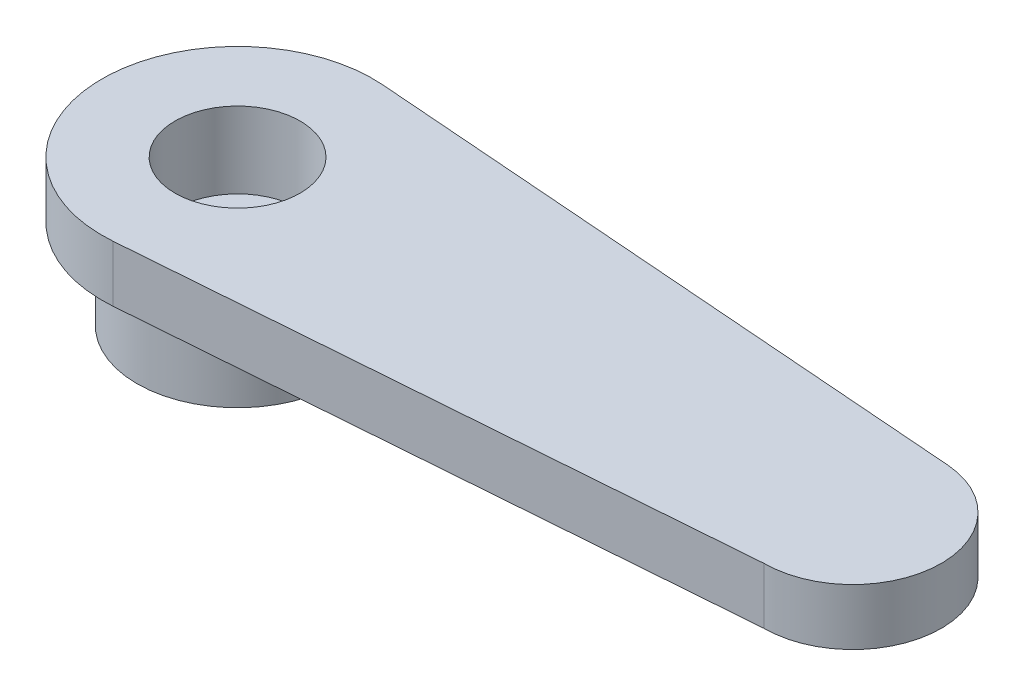
ISO-10303-21;
HEADER;
FILE_DESCRIPTION(('STEP AP214'),'2;1');
FILE_NAME('part.step','',(''),(''),'','','');
FILE_SCHEMA(('AUTOMOTIVE_DESIGN { 1 0 10303 214 1 1 1 1 }'));
ENDSEC;
DATA;
#1=APPLICATION_CONTEXT('core data for automotive mechanical design processes');
#2=APPLICATION_PROTOCOL_DEFINITION('international standard','automotive_design',2000,#1);
#3=PRODUCT_CONTEXT('',#1,'mechanical');
#4=PRODUCT('Part','Part','',(#3));
#5=PRODUCT_RELATED_PRODUCT_CATEGORY('part','',(#4));
#6=PRODUCT_DEFINITION_FORMATION('','',#4);
#7=PRODUCT_DEFINITION_CONTEXT('part definition',#1,'design');
#8=PRODUCT_DEFINITION('design','',#6,#7);
#9=PRODUCT_DEFINITION_SHAPE('','',#8);
#10=(LENGTH_UNIT() NAMED_UNIT(*) SI_UNIT(.MILLI.,.METRE.));
#11=(NAMED_UNIT(*) PLANE_ANGLE_UNIT() SI_UNIT($,.RADIAN.));
#12=(NAMED_UNIT(*) SI_UNIT($,.STERADIAN.) SOLID_ANGLE_UNIT());
#13=UNCERTAINTY_MEASURE_WITH_UNIT(LENGTH_MEASURE(1.E-05),#10,'distance_accuracy_value','');
#14=(GEOMETRIC_REPRESENTATION_CONTEXT(3) GLOBAL_UNCERTAINTY_ASSIGNED_CONTEXT((#13)) GLOBAL_UNIT_ASSIGNED_CONTEXT((#10,
#11,#12)) REPRESENTATION_CONTEXT('',''));
#15=CARTESIAN_POINT('',(0.,0.,0.));
#16=DIRECTION('',(0.,0.,1.));
#17=DIRECTION('',(1.,0.,0.));
#18=AXIS2_PLACEMENT_3D('',#15,#16,#17);
#19=CARTESIAN_POINT('',(0.,2.7,0.));
#20=DIRECTION('',(0.,-1.,0.));
#21=DIRECTION('',(0.,0.,-1.));
#22=AXIS2_PLACEMENT_3D('',#19,#20,#21);
#23=CYLINDRICAL_SURFACE('',#22,6.5);
#24=CARTESIAN_POINT('',(0.,0.,0.));
#25=DIRECTION('',(0.,1.,0.));
#26=DIRECTION('',(0.,0.,1.));
#27=AXIS2_PLACEMENT_3D('',#24,#25,#26);
#28=CIRCLE('',#27,6.5);
#29=CARTESIAN_POINT('',(0.495762711864406,0.,-6.48106621888134));
#30=VERTEX_POINT('',#29);
#31=CARTESIAN_POINT('',(0.498520941628804,0.,6.48085464045889));
#32=VERTEX_POINT('',#31);
#33=EDGE_CURVE('E96',#30,#32,#28,.T.);
#34=ORIENTED_EDGE('',*,*,#33,.T.);
#35=DIRECTION('',(0.,-1.,0.));
#36=VECTOR('',#35,1.);
#37=CARTESIAN_POINT('',(0.498520941628804,2.7,6.48085464045889));
#38=LINE('',#37,#36);
#39=CARTESIAN_POINT('',(0.498520941628804,2.7,6.48085464045889));
#40=VERTEX_POINT('',#39);
#41=EDGE_CURVE('E11',#40,#32,#38,.T.);
#42=ORIENTED_EDGE('',*,*,#41,.F.);
#43=CARTESIAN_POINT('',(0.,2.7,0.));
#44=DIRECTION('',(0.,1.,0.));
#45=DIRECTION('',(0.,0.,1.));
#46=AXIS2_PLACEMENT_3D('',#43,#44,#45);
#47=CIRCLE('',#46,6.5);
#48=CARTESIAN_POINT('',(0.495762711864406,2.7,-6.48106621888134));
#49=VERTEX_POINT('',#48);
#50=EDGE_CURVE('E82',#49,#40,#47,.T.);
#51=ORIENTED_EDGE('',*,*,#50,.F.);
#52=DIRECTION('',(0.,-1.,0.));
#53=VECTOR('',#52,1.);
#54=CARTESIAN_POINT('',(0.495762711864406,2.7,-6.48106621888134));
#55=LINE('',#54,#53);
#56=EDGE_CURVE('E49',#49,#30,#55,.T.);
#57=ORIENTED_EDGE('',*,*,#56,.T.);
#58=EDGE_LOOP('',(#34,#42,#51,#57));
#59=FACE_BOUND('',#58,.T.);
#60=ADVANCED_FACE('F33',(#59),#23,.T.);
#61=CARTESIAN_POINT('',(0.498520941628804,2.7,6.48085464045889));
#62=DIRECTION('',(-0.0766955294813543,0.,-0.997054560070598));
#63=DIRECTION('',(-0.997054560070599,0.,0.0766955294813543));
#64=AXIS2_PLACEMENT_3D('',#61,#62,#63);
#65=PLANE('',#64);
#66=DIRECTION('',(0.997054560070598,0.,-0.0766955294813543));
#67=VECTOR('',#66,1.);
#68=CARTESIAN_POINT('',(0.498520941628804,0.,6.48085464045889));
#69=LINE('',#68,#67);
#70=CARTESIAN_POINT('',(29.5,0.,4.25));
#71=VERTEX_POINT('',#70);
#72=EDGE_CURVE('E87',#32,#71,#69,.T.);
#73=ORIENTED_EDGE('',*,*,#72,.T.);
#74=DIRECTION('',(0.,-1.,0.));
#75=VECTOR('',#74,1.);
#76=CARTESIAN_POINT('',(29.5,2.7,4.25));
#77=LINE('',#76,#75);
#78=CARTESIAN_POINT('',(29.5,2.7,4.25));
#79=VERTEX_POINT('',#78);
#80=EDGE_CURVE('E41',#79,#71,#77,.T.);
#81=ORIENTED_EDGE('',*,*,#80,.F.);
#82=DIRECTION('',(0.997054560070598,0.,-0.0766955294813543));
#83=VECTOR('',#82,1.);
#84=CARTESIAN_POINT('',(0.498520941628804,2.7,6.48085464045889));
#85=LINE('',#84,#83);
#86=EDGE_CURVE('E75',#40,#79,#85,.T.);
#87=ORIENTED_EDGE('',*,*,#86,.F.);
#88=ORIENTED_EDGE('',*,*,#41,.T.);
#89=EDGE_LOOP('',(#73,#81,#87,#88));
#90=FACE_BOUND('',#89,.T.);
#91=ADVANCED_FACE('F86',(#90),#65,.F.);
#92=CARTESIAN_POINT('',(29.5,2.7,0.));
#93=DIRECTION('',(0.,-1.,0.));
#94=DIRECTION('',(0.,0.,-1.));
#95=AXIS2_PLACEMENT_3D('',#92,#93,#94);
#96=CYLINDRICAL_SURFACE('',#95,4.25);
#97=CARTESIAN_POINT('',(29.5,0.,0.));
#98=DIRECTION('',(0.,1.,0.));
#99=DIRECTION('',(0.,0.,1.));
#100=AXIS2_PLACEMENT_3D('',#97,#98,#99);
#101=CIRCLE('',#100,4.25);
#102=CARTESIAN_POINT('',(29.8241525423729,0.,-4.2376202200378));
#103=VERTEX_POINT('',#102);
#104=EDGE_CURVE('E100',#71,#103,#101,.T.);
#105=ORIENTED_EDGE('',*,*,#104,.T.);
#106=DIRECTION('',(0.,-1.,0.));
#107=VECTOR('',#106,1.);
#108=CARTESIAN_POINT('',(29.8241525423729,2.7,-4.2376202200378));
#109=LINE('',#108,#107);
#110=CARTESIAN_POINT('',(29.8241525423729,2.7,-4.2376202200378));
#111=VERTEX_POINT('',#110);
#112=EDGE_CURVE('E64',#111,#103,#109,.T.);
#113=ORIENTED_EDGE('',*,*,#112,.F.);
#114=CARTESIAN_POINT('',(29.5,2.7,0.));
#115=DIRECTION('',(0.,1.,0.));
#116=DIRECTION('',(0.,0.,1.));
#117=AXIS2_PLACEMENT_3D('',#114,#115,#116);
#118=CIRCLE('',#117,4.25);
#119=EDGE_CURVE('E81',#79,#111,#118,.T.);
#120=ORIENTED_EDGE('',*,*,#119,.F.);
#121=ORIENTED_EDGE('',*,*,#80,.T.);
#122=EDGE_LOOP('',(#105,#113,#120,#121));
#123=FACE_BOUND('',#122,.T.);
#124=ADVANCED_FACE('F90',(#123),#96,.T.);
#125=CARTESIAN_POINT('',(0.495762711864406,2.7,-6.48106621888134));
#126=DIRECTION('',(0.0762711864406779,0.,-0.997087110597129));
#127=DIRECTION('',(-0.997087110597129,0.,-0.0762711864406779));
#128=AXIS2_PLACEMENT_3D('',#125,#126,#127);
#129=PLANE('',#128);
#130=DIRECTION('',(0.997087110597129,0.,0.0762711864406779));
#131=VECTOR('',#130,1.);
#132=CARTESIAN_POINT('',(0.495762711864406,0.,-6.48106621888134));
#133=LINE('',#132,#131);
#134=EDGE_CURVE('E102',#30,#103,#133,.T.);
#135=ORIENTED_EDGE('',*,*,#134,.F.);
#136=ORIENTED_EDGE('',*,*,#56,.F.);
#137=DIRECTION('',(0.997087110597129,0.,0.0762711864406779));
#138=VECTOR('',#137,1.);
#139=CARTESIAN_POINT('',(0.495762711864406,2.7,-6.48106621888134));
#140=LINE('',#139,#138);
#141=EDGE_CURVE('E91',#49,#111,#140,.T.);
#142=ORIENTED_EDGE('',*,*,#141,.T.);
#143=ORIENTED_EDGE('',*,*,#112,.T.);
#144=EDGE_LOOP('',(#135,#136,#142,#143));
#145=FACE_BOUND('',#144,.T.);
#146=ADVANCED_FACE('F144',(#145),#129,.T.);
#147=CARTESIAN_POINT('',(0.,2.7,0.));
#148=DIRECTION('',(0.,1.,0.));
#149=DIRECTION('',(0.,0.,1.));
#150=AXIS2_PLACEMENT_3D('',#147,#148,#149);
#151=PLANE('',#150);
#152=CARTESIAN_POINT('',(0.,2.7,0.));
#153=DIRECTION('',(0.,1.,0.));
#154=DIRECTION('',(0.,0.,1.));
#155=AXIS2_PLACEMENT_3D('',#152,#153,#154);
#156=CIRCLE('',#155,3.);
#157=CARTESIAN_POINT('',(0.,2.7,3.));
#158=VERTEX_POINT('',#157);
#159=EDGE_CURVE('E114',#158,#158,#156,.T.);
#160=ORIENTED_EDGE('',*,*,#159,.F.);
#161=EDGE_LOOP('',(#160));
#162=FACE_BOUND('',#161,.T.);
#163=ORIENTED_EDGE('',*,*,#50,.T.);
#164=ORIENTED_EDGE('',*,*,#86,.T.);
#165=ORIENTED_EDGE('',*,*,#119,.T.);
#166=ORIENTED_EDGE('',*,*,#141,.F.);
#167=EDGE_LOOP('',(#163,#164,#165,#166));
#168=FACE_BOUND('',#167,.T.);
#169=ADVANCED_FACE('F78',(#162,#168),#151,.T.);
#170=CARTESIAN_POINT('',(0.,0.,0.));
#171=DIRECTION('',(0.,1.,0.));
#172=DIRECTION('',(0.,0.,1.));
#173=AXIS2_PLACEMENT_3D('',#170,#171,#172);
#174=PLANE('',#173);
#175=CARTESIAN_POINT('',(0.,0.,0.));
#176=DIRECTION('',(0.,1.,0.));
#177=DIRECTION('',(0.,0.,1.));
#178=AXIS2_PLACEMENT_3D('',#175,#176,#177);
#179=CIRCLE('',#178,4.825);
#180=CARTESIAN_POINT('',(0.,0.,4.825));
#181=VERTEX_POINT('',#180);
#182=EDGE_CURVE('E108',#181,#181,#179,.T.);
#183=ORIENTED_EDGE('',*,*,#182,.T.);
#184=EDGE_LOOP('',(#183));
#185=FACE_BOUND('',#184,.T.);
#186=ORIENTED_EDGE('',*,*,#33,.F.);
#187=ORIENTED_EDGE('',*,*,#134,.T.);
#188=ORIENTED_EDGE('',*,*,#104,.F.);
#189=ORIENTED_EDGE('',*,*,#72,.F.);
#190=EDGE_LOOP('',(#186,#187,#188,#189));
#191=FACE_BOUND('',#190,.T.);
#192=ADVANCED_FACE('F143',(#185,#191),#174,.F.);
#193=CARTESIAN_POINT('',(0.,-4.3,0.));
#194=DIRECTION('',(0.,1.,0.));
#195=DIRECTION('',(0.,0.,1.));
#196=AXIS2_PLACEMENT_3D('',#193,#194,#195);
#197=CYLINDRICAL_SURFACE('',#196,4.825);
#198=CARTESIAN_POINT('',(0.,-4.3,0.));
#199=DIRECTION('',(0.,1.,0.));
#200=DIRECTION('',(0.,0.,1.));
#201=AXIS2_PLACEMENT_3D('',#198,#199,#200);
#202=CIRCLE('',#201,4.825);
#203=CARTESIAN_POINT('',(0.,-4.3,4.825));
#204=VERTEX_POINT('',#203);
#205=EDGE_CURVE('E98',#204,#204,#202,.T.);
#206=CARTESIAN_POINT('',(0.,-4.3,4.825));
#207=CARTESIAN_POINT('',(0.,-4.25520833333333,4.825));
#208=CARTESIAN_POINT('',(0.,-4.21041666666667,4.825));
#209=CARTESIAN_POINT('',(0.,-4.12083333333333,4.825));
#210=CARTESIAN_POINT('',(0.,-4.07604166666667,4.825));
#211=CARTESIAN_POINT('',(0.,-3.98645833333333,4.825));
#212=CARTESIAN_POINT('',(0.,-3.94166666666667,4.825));
#213=CARTESIAN_POINT('',(0.,-3.85208333333333,4.825));
#214=CARTESIAN_POINT('',(0.,-3.80729166666667,4.825));
#215=CARTESIAN_POINT('',(0.,-3.71770833333333,4.825));
#216=CARTESIAN_POINT('',(0.,-3.67291666666667,4.825));
#217=CARTESIAN_POINT('',(0.,-3.58333333333333,4.825));
#218=CARTESIAN_POINT('',(0.,-3.53854166666667,4.825));
#219=CARTESIAN_POINT('',(0.,-3.44895833333333,4.825));
#220=CARTESIAN_POINT('',(0.,-3.40416666666667,4.825));
#221=CARTESIAN_POINT('',(0.,-3.31458333333333,4.825));
#222=CARTESIAN_POINT('',(0.,-3.26979166666667,4.825));
#223=CARTESIAN_POINT('',(0.,-3.18020833333333,4.825));
#224=CARTESIAN_POINT('',(0.,-3.13541666666667,4.825));
#225=CARTESIAN_POINT('',(0.,-3.04583333333333,4.825));
#226=CARTESIAN_POINT('',(0.,-3.00104166666667,4.825));
#227=CARTESIAN_POINT('',(0.,-2.91145833333333,4.825));
#228=CARTESIAN_POINT('',(0.,-2.86666666666667,4.825));
#229=CARTESIAN_POINT('',(0.,-2.77708333333333,4.825));
#230=CARTESIAN_POINT('',(0.,-2.73229166666667,4.825));
#231=CARTESIAN_POINT('',(0.,-2.64270833333333,4.825));
#232=CARTESIAN_POINT('',(0.,-2.59791666666667,4.825));
#233=CARTESIAN_POINT('',(0.,-2.50833333333333,4.825));
#234=CARTESIAN_POINT('',(0.,-2.46354166666667,4.825));
#235=CARTESIAN_POINT('',(0.,-2.37395833333333,4.825));
#236=CARTESIAN_POINT('',(0.,-2.32916666666667,4.825));
#237=CARTESIAN_POINT('',(0.,-2.23958333333333,4.825));
#238=CARTESIAN_POINT('',(0.,-2.19479166666667,4.825));
#239=CARTESIAN_POINT('',(0.,-2.10520833333333,4.825));
#240=CARTESIAN_POINT('',(0.,-2.06041666666667,4.825));
#241=CARTESIAN_POINT('',(0.,-1.97083333333333,4.825));
#242=CARTESIAN_POINT('',(0.,-1.92604166666667,4.825));
#243=CARTESIAN_POINT('',(0.,-1.83645833333333,4.825));
#244=CARTESIAN_POINT('',(0.,-1.79166666666667,4.825));
#245=CARTESIAN_POINT('',(0.,-1.70208333333333,4.825));
#246=CARTESIAN_POINT('',(0.,-1.65729166666667,4.825));
#247=CARTESIAN_POINT('',(0.,-1.56770833333333,4.825));
#248=CARTESIAN_POINT('',(0.,-1.52291666666667,4.825));
#249=CARTESIAN_POINT('',(0.,-1.43333333333333,4.825));
#250=CARTESIAN_POINT('',(0.,-1.38854166666667,4.825));
#251=CARTESIAN_POINT('',(0.,-1.29895833333333,4.825));
#252=CARTESIAN_POINT('',(0.,-1.25416666666667,4.825));
#253=CARTESIAN_POINT('',(0.,-1.16458333333333,4.825));
#254=CARTESIAN_POINT('',(0.,-1.11979166666667,4.825));
#255=CARTESIAN_POINT('',(0.,-1.03020833333333,4.825));
#256=CARTESIAN_POINT('',(0.,-0.985416666666668,4.825));
#257=CARTESIAN_POINT('',(0.,-0.895833333333334,4.825));
#258=CARTESIAN_POINT('',(0.,-0.851041666666668,4.825));
#259=CARTESIAN_POINT('',(0.,-0.761458333333334,4.825));
#260=CARTESIAN_POINT('',(0.,-0.716666666666668,4.825));
#261=CARTESIAN_POINT('',(0.,-0.627083333333334,4.825));
#262=CARTESIAN_POINT('',(0.,-0.582291666666667,4.825));
#263=CARTESIAN_POINT('',(0.,-0.492708333333334,4.825));
#264=CARTESIAN_POINT('',(0.,-0.447916666666667,4.825));
#265=CARTESIAN_POINT('',(0.,-0.358333333333334,4.825));
#266=CARTESIAN_POINT('',(0.,-0.313541666666667,4.825));
#267=CARTESIAN_POINT('',(0.,-0.223958333333334,4.825));
#268=CARTESIAN_POINT('',(0.,-0.179166666666667,4.825));
#269=CARTESIAN_POINT('',(0.,-0.0895833333333342,4.825));
#270=CARTESIAN_POINT('',(0.,-0.0447916666666675,4.825));
#271=CARTESIAN_POINT('',(0.,0.,4.825));
#272=B_SPLINE_CURVE_WITH_KNOTS('',3,(#206,#207,#208,#209,#210,#211,#212,#213,#214,#215,#216,
#217,#218,#219,#220,#221,#222,#223,#224,#225,#226,#227,#228,#229,#230,#231,#232,#233,#234,#235,
#236,#237,#238,#239,#240,#241,#242,#243,#244,#245,#246,#247,#248,#249,#250,#251,#252,#253,#254,
#255,#256,#257,#258,#259,#260,#261,#262,#263,#264,#265,#266,#267,#268,#269,#270,#271),
.UNSPECIFIED.,.F.,.F.,(4,2,2,2,2,2,2,2,2,2,2,2,2,2,2,2,2,2,2,2,2,2,2,2,2,2,2,2,2,2,2,2,4),(0.,
0.134375,0.26875,0.403124999999999,0.537499999999999,0.671874999999999,0.80625,0.940625,1.075,
1.209375,1.34375,1.478125,1.6125,1.746875,1.88125,2.015625,2.15,2.284375,2.41875,2.553125,
2.6875,2.821875,2.95625,3.090625,3.225,3.359375,3.49375,3.628125,3.7625,3.896875,4.03125,
4.165625,4.3),.UNSPECIFIED.);
#273=EDGE_CURVE('BSEAM150',#204,#181,#272,.T.);
#274=ORIENTED_EDGE('',*,*,#205,.T.);
#275=ORIENTED_EDGE('',*,*,#182,.F.);
#276=ORIENTED_EDGE('',*,*,#273,.T.);
#277=ORIENTED_EDGE('',*,*,#273,.F.);
#278=EDGE_LOOP('',(#274,#276,#275,#277));
#279=FACE_BOUND('',#278,.T.);
#280=ADVANCED_FACE('F150',(#279),#197,.T.);
#281=CARTESIAN_POINT('',(0.,-4.3,0.));
#282=DIRECTION('',(0.,1.,0.));
#283=DIRECTION('',(0.,0.,1.));
#284=AXIS2_PLACEMENT_3D('',#281,#282,#283);
#285=PLANE('',#284);
#286=CARTESIAN_POINT('',(0.,-4.3,0.));
#287=DIRECTION('',(0.,1.,0.));
#288=DIRECTION('',(0.,0.,1.));
#289=AXIS2_PLACEMENT_3D('',#286,#287,#288);
#290=CIRCLE('',#289,2.);
#291=CARTESIAN_POINT('',(0.,-4.3,2.));
#292=VERTEX_POINT('',#291);
#293=EDGE_CURVE('E117',#292,#292,#290,.T.);
#294=ORIENTED_EDGE('',*,*,#293,.T.);
#295=EDGE_LOOP('',(#294));
#296=FACE_BOUND('',#295,.T.);
#297=ORIENTED_EDGE('',*,*,#205,.F.);
#298=EDGE_LOOP('',(#297));
#299=FACE_BOUND('',#298,.T.);
#300=ADVANCED_FACE('F138',(#296,#299),#285,.F.);
#301=CARTESIAN_POINT('',(0.,-0.95,0.));
#302=DIRECTION('',(0.,1.,0.));
#303=DIRECTION('',(0.,0.,1.));
#304=AXIS2_PLACEMENT_3D('',#301,#302,#303);
#305=CYLINDRICAL_SURFACE('',#304,3.);
#306=CARTESIAN_POINT('',(0.,-0.95,0.));
#307=DIRECTION('',(0.,1.,0.));
#308=DIRECTION('',(0.,0.,1.));
#309=AXIS2_PLACEMENT_3D('',#306,#307,#308);
#310=CIRCLE('',#309,3.);
#311=CARTESIAN_POINT('',(0.,-0.95,3.));
#312=VERTEX_POINT('',#311);
#313=EDGE_CURVE('E111',#312,#312,#310,.T.);
#314=ORIENTED_EDGE('',*,*,#313,.F.);
#315=EDGE_LOOP('',(#314));
#316=FACE_BOUND('',#315,.T.);
#317=ORIENTED_EDGE('',*,*,#159,.T.);
#318=EDGE_LOOP('',(#317));
#319=FACE_BOUND('',#318,.T.);
#320=ADVANCED_FACE('F132',(#316,#319),#305,.F.);
#321=CARTESIAN_POINT('',(0.,-0.95,0.));
#322=DIRECTION('',(0.,1.,0.));
#323=DIRECTION('',(0.,0.,1.));
#324=AXIS2_PLACEMENT_3D('',#321,#322,#323);
#325=PLANE('',#324);
#326=CARTESIAN_POINT('',(0.,-0.95,0.));
#327=DIRECTION('',(0.,1.,0.));
#328=DIRECTION('',(0.,0.,1.));
#329=AXIS2_PLACEMENT_3D('',#326,#327,#328);
#330=CIRCLE('',#329,2.);
#331=CARTESIAN_POINT('',(0.,-0.95,2.));
#332=VERTEX_POINT('',#331);
#333=EDGE_CURVE('E122',#332,#332,#330,.T.);
#334=ORIENTED_EDGE('',*,*,#333,.F.);
#335=EDGE_LOOP('',(#334));
#336=FACE_BOUND('',#335,.T.);
#337=ORIENTED_EDGE('',*,*,#313,.T.);
#338=EDGE_LOOP('',(#337));
#339=FACE_BOUND('',#338,.T.);
#340=ADVANCED_FACE('F129',(#336,#339),#325,.T.);
#341=CARTESIAN_POINT('',(0.,-4.6,0.));
#342=DIRECTION('',(0.,1.,0.));
#343=DIRECTION('',(0.,0.,1.));
#344=AXIS2_PLACEMENT_3D('',#341,#342,#343);
#345=CYLINDRICAL_SURFACE('',#344,2.);
#346=ORIENTED_EDGE('',*,*,#333,.T.);
#347=EDGE_LOOP('',(#346));
#348=FACE_BOUND('',#347,.T.);
#349=ORIENTED_EDGE('',*,*,#293,.F.);
#350=EDGE_LOOP('',(#349));
#351=FACE_BOUND('',#350,.T.);
#352=ADVANCED_FACE('F126',(#348,#351),#345,.F.);
#353=CLOSED_SHELL('',(#60,#91,#124,#146,#169,#192,#280,#300,#320,#340,#352));
#354=MANIFOLD_SOLID_BREP('B2',#353);
#355=ADVANCED_BREP_SHAPE_REPRESENTATION('',(#18,#354),#14);
#356=SHAPE_DEFINITION_REPRESENTATION(#9,#355);
ENDSEC;
END-ISO-10303-21;
